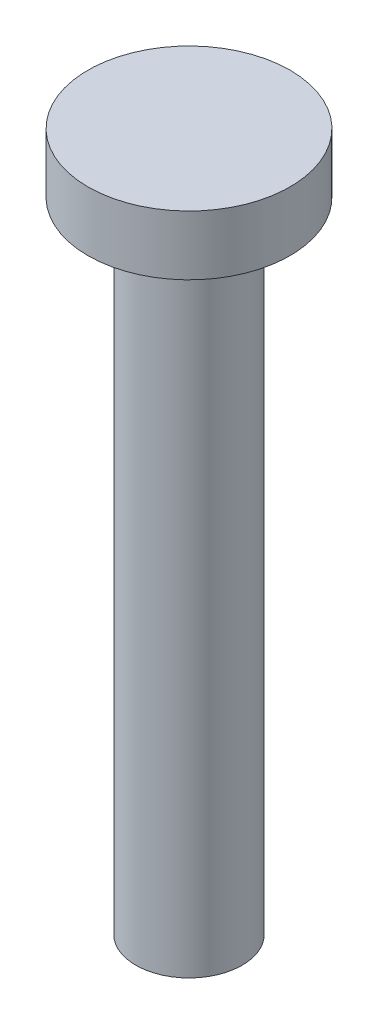
ISO-10303-21;
HEADER;
FILE_DESCRIPTION(('STEP AP214'),'2;1');
FILE_NAME('part.step','',(''),(''),'','','');
FILE_SCHEMA(('AUTOMOTIVE_DESIGN { 1 0 10303 214 1 1 1 1 }'));
ENDSEC;
DATA;
#1=APPLICATION_CONTEXT('core data for automotive mechanical design processes');
#2=APPLICATION_PROTOCOL_DEFINITION('international standard','automotive_design',2000,#1);
#3=PRODUCT_CONTEXT('',#1,'mechanical');
#4=PRODUCT('Part','Part','',(#3));
#5=PRODUCT_RELATED_PRODUCT_CATEGORY('part','',(#4));
#6=PRODUCT_DEFINITION_FORMATION('','',#4);
#7=PRODUCT_DEFINITION_CONTEXT('part definition',#1,'design');
#8=PRODUCT_DEFINITION('design','',#6,#7);
#9=PRODUCT_DEFINITION_SHAPE('','',#8);
#10=(LENGTH_UNIT() NAMED_UNIT(*) SI_UNIT(.MILLI.,.METRE.));
#11=(NAMED_UNIT(*) PLANE_ANGLE_UNIT() SI_UNIT($,.RADIAN.));
#12=(NAMED_UNIT(*) SI_UNIT($,.STERADIAN.) SOLID_ANGLE_UNIT());
#13=UNCERTAINTY_MEASURE_WITH_UNIT(LENGTH_MEASURE(1.E-05),#10,'distance_accuracy_value','');
#14=(GEOMETRIC_REPRESENTATION_CONTEXT(3) GLOBAL_UNCERTAINTY_ASSIGNED_CONTEXT((#13)) GLOBAL_UNIT_ASSIGNED_CONTEXT((#10,
#11,#12)) REPRESENTATION_CONTEXT('',''));
#15=CARTESIAN_POINT('',(0.,0.,0.));
#16=DIRECTION('',(0.,0.,1.));
#17=DIRECTION('',(1.,0.,0.));
#18=AXIS2_PLACEMENT_3D('',#15,#16,#17);
#19=CARTESIAN_POINT('',(0.,-30.,0.));
#20=DIRECTION('',(0.,-1.,0.));
#21=DIRECTION('',(0.,0.,-1.));
#22=AXIS2_PLACEMENT_3D('',#19,#20,#21);
#23=PLANE('',#22);
#24=CARTESIAN_POINT('',(0.,-30.,0.));
#25=DIRECTION('',(0.,-1.,0.));
#26=DIRECTION('',(0.,0.,-1.));
#27=AXIS2_PLACEMENT_3D('',#24,#25,#26);
#28=CIRCLE('',#27,2.5);
#29=CARTESIAN_POINT('',(0.,-30.,-2.5));
#30=VERTEX_POINT('',#29);
#31=EDGE_CURVE('E10',#30,#30,#28,.T.);
#32=ORIENTED_EDGE('',*,*,#31,.T.);
#33=EDGE_LOOP('',(#32));
#34=FACE_BOUND('',#33,.T.);
#35=ADVANCED_FACE('F37',(#34),#23,.T.);
#36=CARTESIAN_POINT('',(0.,-10.,0.));
#37=DIRECTION('',(0.,-1.,0.));
#38=DIRECTION('',(0.,0.,-1.));
#39=AXIS2_PLACEMENT_3D('',#36,#37,#38);
#40=CYLINDRICAL_SURFACE('',#39,2.5);
#41=CARTESIAN_POINT('',(0.,0.,0.));
#42=DIRECTION('',(0.,-1.,0.));
#43=DIRECTION('',(0.,0.,-1.));
#44=AXIS2_PLACEMENT_3D('',#41,#42,#43);
#45=CIRCLE('',#44,2.5);
#46=CARTESIAN_POINT('',(0.,0.,-2.5));
#47=VERTEX_POINT('',#46);
#48=EDGE_CURVE('E43',#47,#47,#45,.T.);
#49=ORIENTED_EDGE('',*,*,#48,.T.);
#50=EDGE_LOOP('',(#49));
#51=FACE_BOUND('',#50,.T.);
#52=ORIENTED_EDGE('',*,*,#31,.F.);
#53=EDGE_LOOP('',(#52));
#54=FACE_BOUND('',#53,.T.);
#55=ADVANCED_FACE('F69',(#51,#54),#40,.T.);
#56=CARTESIAN_POINT('',(2.5,0.,0.));
#57=DIRECTION('',(0.,-1.,0.));
#58=DIRECTION('',(0.,0.,-1.));
#59=AXIS2_PLACEMENT_3D('',#56,#57,#58);
#60=PLANE('',#59);
#61=CARTESIAN_POINT('',(0.,0.,0.));
#62=DIRECTION('',(0.,-1.,0.));
#63=DIRECTION('',(0.,0.,-1.));
#64=AXIS2_PLACEMENT_3D('',#61,#62,#63);
#65=CIRCLE('',#64,4.75);
#66=CARTESIAN_POINT('',(0.,0.,-4.75));
#67=VERTEX_POINT('',#66);
#68=EDGE_CURVE('E47',#67,#67,#65,.T.);
#69=ORIENTED_EDGE('',*,*,#68,.T.);
#70=EDGE_LOOP('',(#69));
#71=FACE_BOUND('',#70,.T.);
#72=ORIENTED_EDGE('',*,*,#48,.F.);
#73=EDGE_LOOP('',(#72));
#74=FACE_BOUND('',#73,.T.);
#75=ADVANCED_FACE('F66',(#71,#74),#60,.T.);
#76=CARTESIAN_POINT('',(0.,-10.,0.));
#77=DIRECTION('',(0.,-1.,0.));
#78=DIRECTION('',(0.,0.,-1.));
#79=AXIS2_PLACEMENT_3D('',#76,#77,#78);
#80=CYLINDRICAL_SURFACE('',#79,4.75);
#81=CARTESIAN_POINT('',(0.,2.8,0.));
#82=DIRECTION('',(0.,-1.,0.));
#83=DIRECTION('',(0.,0.,-1.));
#84=AXIS2_PLACEMENT_3D('',#81,#82,#83);
#85=CIRCLE('',#84,4.75);
#86=CARTESIAN_POINT('',(0.,2.8,-4.75));
#87=VERTEX_POINT('',#86);
#88=EDGE_CURVE('E51',#87,#87,#85,.T.);
#89=ORIENTED_EDGE('',*,*,#88,.T.);
#90=EDGE_LOOP('',(#89));
#91=FACE_BOUND('',#90,.T.);
#92=ORIENTED_EDGE('',*,*,#68,.F.);
#93=EDGE_LOOP('',(#92));
#94=FACE_BOUND('',#93,.T.);
#95=ADVANCED_FACE('F57',(#91,#94),#80,.T.);
#96=CARTESIAN_POINT('',(4.75,2.8,0.));
#97=DIRECTION('',(0.,1.,0.));
#98=DIRECTION('',(0.,0.,1.));
#99=AXIS2_PLACEMENT_3D('',#96,#97,#98);
#100=PLANE('',#99);
#101=ORIENTED_EDGE('',*,*,#88,.F.);
#102=EDGE_LOOP('',(#101));
#103=FACE_BOUND('',#102,.T.);
#104=ADVANCED_FACE('F60',(#103),#100,.T.);
#105=CLOSED_SHELL('',(#35,#55,#75,#95,#104));
#106=MANIFOLD_SOLID_BREP('B2',#105);
#107=ADVANCED_BREP_SHAPE_REPRESENTATION('',(#18,#106),#14);
#108=SHAPE_DEFINITION_REPRESENTATION(#9,#107);
ENDSEC;
END-ISO-10303-21;
